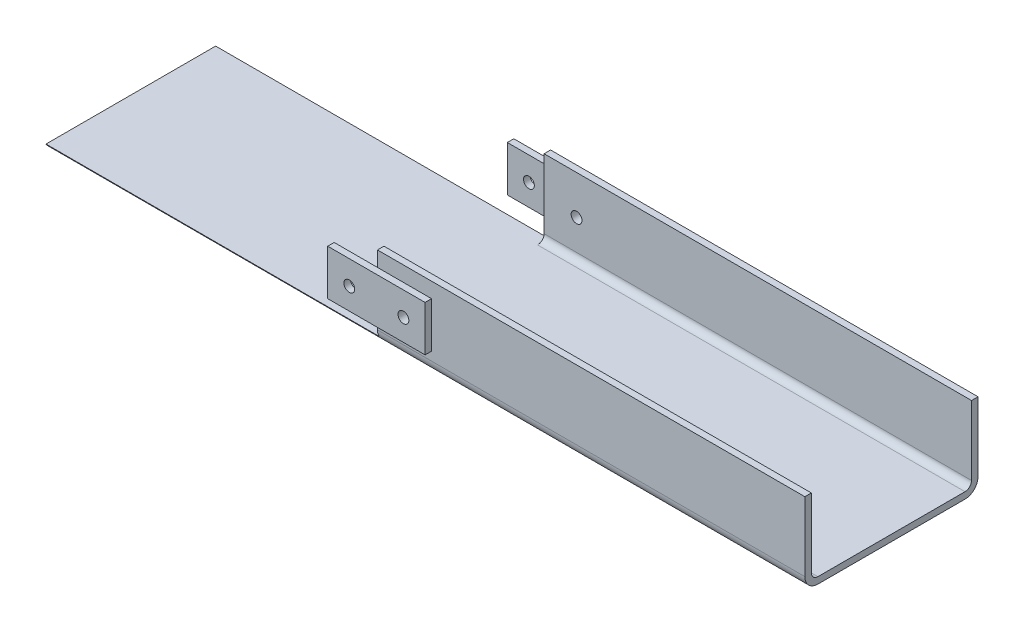
ISO-10303-21;
HEADER;
FILE_DESCRIPTION(('STEP AP214'),'2;1');
FILE_NAME('part.step','',(''),(''),'','','');
FILE_SCHEMA(('AUTOMOTIVE_DESIGN { 1 0 10303 214 1 1 1 1 }'));
ENDSEC;
DATA;
#1=APPLICATION_CONTEXT('core data for automotive mechanical design processes');
#2=APPLICATION_PROTOCOL_DEFINITION('international standard','automotive_design',2000,#1);
#3=PRODUCT_CONTEXT('',#1,'mechanical');
#4=PRODUCT('Part','Part','',(#3));
#5=PRODUCT_RELATED_PRODUCT_CATEGORY('part','',(#4));
#6=PRODUCT_DEFINITION_FORMATION('','',#4);
#7=PRODUCT_DEFINITION_CONTEXT('part definition',#1,'design');
#8=PRODUCT_DEFINITION('design','',#6,#7);
#9=PRODUCT_DEFINITION_SHAPE('','',#8);
#10=(LENGTH_UNIT() NAMED_UNIT(*) SI_UNIT(.MILLI.,.METRE.));
#11=(NAMED_UNIT(*) PLANE_ANGLE_UNIT() SI_UNIT($,.RADIAN.));
#12=(NAMED_UNIT(*) SI_UNIT($,.STERADIAN.) SOLID_ANGLE_UNIT());
#13=UNCERTAINTY_MEASURE_WITH_UNIT(LENGTH_MEASURE(1.E-05),#10,'distance_accuracy_value','');
#14=(GEOMETRIC_REPRESENTATION_CONTEXT(3) GLOBAL_UNCERTAINTY_ASSIGNED_CONTEXT((#13)) GLOBAL_UNIT_ASSIGNED_CONTEXT((#10,
#11,#12)) REPRESENTATION_CONTEXT('',''));
#15=CARTESIAN_POINT('',(0.,0.,0.));
#16=DIRECTION('',(0.,0.,1.));
#17=DIRECTION('',(1.,0.,0.));
#18=AXIS2_PLACEMENT_3D('',#15,#16,#17);
#19=CARTESIAN_POINT('',(0.,0.,40.));
#20=DIRECTION('',(0.,0.,1.));
#21=DIRECTION('',(1.,0.,0.));
#22=AXIS2_PLACEMENT_3D('',#19,#20,#21);
#23=PLANE('',#22);
#24=DIRECTION('',(0.,1.,0.));
#25=VECTOR('',#24,1.);
#26=CARTESIAN_POINT('',(75.,10.,40.));
#27=LINE('',#26,#25);
#28=CARTESIAN_POINT('',(75.,10.,40.));
#29=VERTEX_POINT('',#28);
#30=CARTESIAN_POINT('',(75.,31.,40.));
#31=VERTEX_POINT('',#30);
#32=EDGE_CURVE('E63',#29,#31,#27,.T.);
#33=ORIENTED_EDGE('',*,*,#32,.F.);
#34=DIRECTION('',(1.,0.,0.));
#35=VECTOR('',#34,1.);
#36=CARTESIAN_POINT('',(30.,10.,40.));
#37=LINE('',#36,#35);
#38=CARTESIAN_POINT('',(50.,10.,40.));
#39=VERTEX_POINT('',#38);
#40=EDGE_CURVE('E260',#39,#29,#37,.T.);
#41=ORIENTED_EDGE('',*,*,#40,.F.);
#42=DIRECTION('',(0.,-1.,0.));
#43=VECTOR('',#42,1.);
#44=CARTESIAN_POINT('',(50.,38.,40.));
#45=LINE('',#44,#43);
#46=CARTESIAN_POINT('',(50.,6.,40.));
#47=VERTEX_POINT('',#46);
#48=EDGE_CURVE('E308',#39,#47,#45,.T.);
#49=ORIENTED_EDGE('',*,*,#48,.T.);
#50=DIRECTION('',(1.,0.,0.));
#51=VECTOR('',#50,1.);
#52=CARTESIAN_POINT('',(247.5,6.,40.));
#53=LINE('',#52,#51);
#54=CARTESIAN_POINT('',(247.5,6.,40.));
#55=VERTEX_POINT('',#54);
#56=EDGE_CURVE('E360',#47,#55,#53,.T.);
#57=ORIENTED_EDGE('',*,*,#56,.T.);
#58=DIRECTION('',(0.,1.,0.));
#59=VECTOR('',#58,1.);
#60=CARTESIAN_POINT('',(247.5,0.,40.));
#61=LINE('',#60,#59);
#62=CARTESIAN_POINT('',(247.5,38.,40.));
#63=VERTEX_POINT('',#62);
#64=EDGE_CURVE('E325',#55,#63,#61,.T.);
#65=ORIENTED_EDGE('',*,*,#64,.T.);
#66=DIRECTION('',(-1.,0.,0.));
#67=VECTOR('',#66,1.);
#68=CARTESIAN_POINT('',(247.5,38.,40.));
#69=LINE('',#68,#67);
#70=CARTESIAN_POINT('',(50.,38.,40.));
#71=VERTEX_POINT('',#70);
#72=EDGE_CURVE('E306',#63,#71,#69,.T.);
#73=ORIENTED_EDGE('',*,*,#72,.T.);
#74=CARTESIAN_POINT('',(50.,31.,40.));
#75=VERTEX_POINT('',#74);
#76=EDGE_CURVE('E303',#71,#75,#45,.T.);
#77=ORIENTED_EDGE('',*,*,#76,.T.);
#78=DIRECTION('',(-1.,0.,0.));
#79=VECTOR('',#78,1.);
#80=CARTESIAN_POINT('',(75.,31.,40.));
#81=LINE('',#80,#79);
#82=EDGE_CURVE('E251',#31,#75,#81,.T.);
#83=ORIENTED_EDGE('',*,*,#82,.F.);
#84=EDGE_LOOP('',(#33,#41,#49,#57,#65,#73,#77,#83));
#85=FACE_BOUND('',#84,.T.);
#86=ADVANCED_FACE('F39',(#85),#23,.T.);
#87=CARTESIAN_POINT('',(-103.962954093293,3.,40.));
#88=DIRECTION('',(0.961884622420712,0.273455614589577,0.));
#89=DIRECTION('',(-0.273455614589577,0.961884622420712,0.));
#90=AXIS2_PLACEMENT_3D('',#87,#88,#89);
#91=PLANE('',#90);
#92=DIRECTION('',(0.,0.,-1.));
#93=VECTOR('',#92,1.);
#94=CARTESIAN_POINT('',(-103.962954093293,3.,40.));
#95=LINE('',#94,#93);
#96=CARTESIAN_POINT('',(-103.962954093293,3.,39.1961524227066));
#97=VERTEX_POINT('',#96);
#98=CARTESIAN_POINT('',(-103.962954093293,3.,-39.1961524227066));
#99=VERTEX_POINT('',#98);
#100=EDGE_CURVE('E327',#97,#99,#95,.T.);
#101=ORIENTED_EDGE('',*,*,#100,.T.);
#102=CARTESIAN_POINT('',(-104.81582856976,6.,-34.));
#103=DIRECTION('',(0.961884622420712,0.273455614589577,0.));
#104=DIRECTION('',(0.273455614589577,-0.961884622420712,0.));
#105=AXIS2_PLACEMENT_3D('',#102,#103,#104);
#106=ELLIPSE('',#105,6.23775436278437,6.);
#107=CARTESIAN_POINT('',(-103.110079616826,0.,-34.));
#108=VERTEX_POINT('',#107);
#109=EDGE_CURVE('E11',#99,#108,#106,.F.);
#110=ORIENTED_EDGE('',*,*,#109,.T.);
#111=DIRECTION('',(0.,0.,-1.));
#112=VECTOR('',#111,1.);
#113=CARTESIAN_POINT('',(-103.110079616826,0.,40.));
#114=LINE('',#113,#112);
#115=CARTESIAN_POINT('',(-103.110079616826,0.,34.));
#116=VERTEX_POINT('',#115);
#117=EDGE_CURVE('E337',#116,#108,#114,.T.);
#118=ORIENTED_EDGE('',*,*,#117,.F.);
#119=CARTESIAN_POINT('',(-104.81582856976,6.,34.));
#120=DIRECTION('',(0.961884622420712,0.273455614589577,0.));
#121=DIRECTION('',(-0.273455614589577,0.961884622420712,0.));
#122=AXIS2_PLACEMENT_3D('',#119,#120,#121);
#123=ELLIPSE('',#122,6.23775436278437,6.);
#124=EDGE_CURVE('E367',#116,#97,#123,.F.);
#125=ORIENTED_EDGE('',*,*,#124,.T.);
#126=EDGE_LOOP('',(#101,#110,#118,#125));
#127=FACE_BOUND('',#126,.T.);
#128=ADVANCED_FACE('F394',(#127),#91,.F.);
#129=CARTESIAN_POINT('',(-103.110079616826,0.,40.));
#130=DIRECTION('',(0.,1.,0.));
#131=DIRECTION('',(0.,0.,1.));
#132=AXIS2_PLACEMENT_3D('',#129,#130,#131);
#133=PLANE('',#132);
#134=ORIENTED_EDGE('',*,*,#117,.T.);
#135=DIRECTION('',(1.,0.,0.));
#136=VECTOR('',#135,1.);
#137=CARTESIAN_POINT('',(-103.110079616826,0.,-34.));
#138=LINE('',#137,#136);
#139=CARTESIAN_POINT('',(247.5,0.,-34.));
#140=VERTEX_POINT('',#139);
#141=EDGE_CURVE('E374',#108,#140,#138,.T.);
#142=ORIENTED_EDGE('',*,*,#141,.T.);
#143=DIRECTION('',(0.,0.,-1.));
#144=VECTOR('',#143,1.);
#145=CARTESIAN_POINT('',(247.5,0.,40.));
#146=LINE('',#145,#144);
#147=CARTESIAN_POINT('',(247.5,0.,34.));
#148=VERTEX_POINT('',#147);
#149=EDGE_CURVE('E334',#148,#140,#146,.T.);
#150=ORIENTED_EDGE('',*,*,#149,.F.);
#151=DIRECTION('',(1.,0.,0.));
#152=VECTOR('',#151,1.);
#153=CARTESIAN_POINT('',(-103.110079616826,0.,34.));
#154=LINE('',#153,#152);
#155=EDGE_CURVE('E365',#148,#116,#154,.F.);
#156=ORIENTED_EDGE('',*,*,#155,.T.);
#157=EDGE_LOOP('',(#134,#142,#150,#156));
#158=FACE_BOUND('',#157,.T.);
#159=ADVANCED_FACE('F401',(#158),#133,.F.);
#160=CARTESIAN_POINT('',(247.5,0.,40.));
#161=DIRECTION('',(-1.,0.,0.));
#162=DIRECTION('',(0.,0.,1.));
#163=AXIS2_PLACEMENT_3D('',#160,#161,#162);
#164=PLANE('',#163);
#165=ORIENTED_EDGE('',*,*,#149,.T.);
#166=CARTESIAN_POINT('',(247.5,6.,-34.));
#167=DIRECTION('',(-1.,0.,0.));
#168=DIRECTION('',(0.,0.,1.));
#169=AXIS2_PLACEMENT_3D('',#166,#167,#168);
#170=CIRCLE('',#169,6.);
#171=CARTESIAN_POINT('',(247.5,6.,-40.));
#172=VERTEX_POINT('',#171);
#173=EDGE_CURVE('E377',#140,#172,#170,.F.);
#174=ORIENTED_EDGE('',*,*,#173,.T.);
#175=DIRECTION('',(0.,1.,0.));
#176=VECTOR('',#175,1.);
#177=CARTESIAN_POINT('',(247.5,0.,-40.));
#178=LINE('',#177,#176);
#179=CARTESIAN_POINT('',(247.5,38.,-40.));
#180=VERTEX_POINT('',#179);
#181=EDGE_CURVE('E324',#172,#180,#178,.T.);
#182=ORIENTED_EDGE('',*,*,#181,.T.);
#183=DIRECTION('',(0.,0.,1.));
#184=VECTOR('',#183,1.);
#185=CARTESIAN_POINT('',(247.5,38.,-40.));
#186=LINE('',#185,#184);
#187=CARTESIAN_POINT('',(247.5,38.,-37.));
#188=VERTEX_POINT('',#187);
#189=EDGE_CURVE('E299',#180,#188,#186,.T.);
#190=ORIENTED_EDGE('',*,*,#189,.T.);
#191=DIRECTION('',(0.,1.,0.));
#192=VECTOR('',#191,1.);
#193=CARTESIAN_POINT('',(247.5,3.,-37.));
#194=LINE('',#193,#192);
#195=CARTESIAN_POINT('',(247.5,6.,-37.));
#196=VERTEX_POINT('',#195);
#197=EDGE_CURVE('E291',#196,#188,#194,.T.);
#198=ORIENTED_EDGE('',*,*,#197,.F.);
#199=CARTESIAN_POINT('',(247.5,6.,-34.));
#200=DIRECTION('',(-1.,0.,0.));
#201=DIRECTION('',(0.,0.,1.));
#202=AXIS2_PLACEMENT_3D('',#199,#200,#201);
#203=CIRCLE('',#202,3.);
#204=CARTESIAN_POINT('',(247.5,3.,-34.));
#205=VERTEX_POINT('',#204);
#206=EDGE_CURVE('E356',#196,#205,#203,.T.);
#207=ORIENTED_EDGE('',*,*,#206,.T.);
#208=DIRECTION('',(0.,0.,-1.));
#209=VECTOR('',#208,1.);
#210=CARTESIAN_POINT('',(247.5,3.,40.));
#211=LINE('',#210,#209);
#212=CARTESIAN_POINT('',(247.5,3.,34.));
#213=VERTEX_POINT('',#212);
#214=EDGE_CURVE('E331',#213,#205,#211,.T.);
#215=ORIENTED_EDGE('',*,*,#214,.F.);
#216=CARTESIAN_POINT('',(247.5,6.,34.));
#217=DIRECTION('',(-1.,0.,0.));
#218=DIRECTION('',(0.,0.,1.));
#219=AXIS2_PLACEMENT_3D('',#216,#217,#218);
#220=CIRCLE('',#219,3.);
#221=CARTESIAN_POINT('',(247.5,6.,37.));
#222=VERTEX_POINT('',#221);
#223=EDGE_CURVE('E345',#213,#222,#220,.T.);
#224=ORIENTED_EDGE('',*,*,#223,.T.);
#225=DIRECTION('',(0.,1.,0.));
#226=VECTOR('',#225,1.);
#227=CARTESIAN_POINT('',(247.5,3.,37.));
#228=LINE('',#227,#226);
#229=CARTESIAN_POINT('',(247.5,38.,37.));
#230=VERTEX_POINT('',#229);
#231=EDGE_CURVE('E313',#222,#230,#228,.T.);
#232=ORIENTED_EDGE('',*,*,#231,.T.);
#233=DIRECTION('',(0.,0.,-1.));
#234=VECTOR('',#233,1.);
#235=CARTESIAN_POINT('',(247.5,38.,40.));
#236=LINE('',#235,#234);
#237=EDGE_CURVE('E319',#63,#230,#236,.T.);
#238=ORIENTED_EDGE('',*,*,#237,.F.);
#239=ORIENTED_EDGE('',*,*,#64,.F.);
#240=CARTESIAN_POINT('',(247.5,6.,34.));
#241=DIRECTION('',(-1.,0.,0.));
#242=DIRECTION('',(0.,0.,1.));
#243=AXIS2_PLACEMENT_3D('',#240,#241,#242);
#244=CIRCLE('',#243,6.);
#245=EDGE_CURVE('E363',#55,#148,#244,.F.);
#246=ORIENTED_EDGE('',*,*,#245,.T.);
#247=EDGE_LOOP('',(#165,#174,#182,#190,#198,#207,#215,#224,#232,#238,#239,#246));
#248=FACE_BOUND('',#247,.T.);
#249=ADVANCED_FACE('F404',(#248),#164,.F.);
#250=CARTESIAN_POINT('',(247.5,3.,40.));
#251=DIRECTION('',(0.,-1.,0.));
#252=DIRECTION('',(0.,0.,-1.));
#253=AXIS2_PLACEMENT_3D('',#250,#251,#252);
#254=PLANE('',#253);
#255=DIRECTION('',(0.,0.,1.));
#256=VECTOR('',#255,1.);
#257=CARTESIAN_POINT('',(50.,3.,-40.));
#258=LINE('',#257,#256);
#259=CARTESIAN_POINT('',(50.,3.,-39.1961524227066));
#260=VERTEX_POINT('',#259);
#261=CARTESIAN_POINT('',(50.,3.,-34.));
#262=VERTEX_POINT('',#261);
#263=EDGE_CURVE('E288',#260,#262,#258,.T.);
#264=ORIENTED_EDGE('',*,*,#263,.F.);
#265=DIRECTION('',(1.,0.,0.));
#266=VECTOR('',#265,1.);
#267=CARTESIAN_POINT('',(50.,3.,-39.1961524227066));
#268=LINE('',#267,#266);
#269=EDGE_CURVE('E48',#260,#99,#268,.F.);
#270=ORIENTED_EDGE('',*,*,#269,.T.);
#271=ORIENTED_EDGE('',*,*,#100,.F.);
#272=DIRECTION('',(-1.,0.,0.));
#273=VECTOR('',#272,1.);
#274=CARTESIAN_POINT('',(-103.962954093293,3.,39.1961524227066));
#275=LINE('',#274,#273);
#276=CARTESIAN_POINT('',(50.,3.,39.1961524227066));
#277=VERTEX_POINT('',#276);
#278=EDGE_CURVE('E369',#97,#277,#275,.F.);
#279=ORIENTED_EDGE('',*,*,#278,.T.);
#280=DIRECTION('',(0.,0.,-1.));
#281=VECTOR('',#280,1.);
#282=CARTESIAN_POINT('',(50.,3.,40.));
#283=LINE('',#282,#281);
#284=CARTESIAN_POINT('',(50.,3.,34.));
#285=VERTEX_POINT('',#284);
#286=EDGE_CURVE('E322',#277,#285,#283,.T.);
#287=ORIENTED_EDGE('',*,*,#286,.T.);
#288=DIRECTION('',(1.,0.,0.));
#289=VECTOR('',#288,1.);
#290=CARTESIAN_POINT('',(247.5,3.,34.));
#291=LINE('',#290,#289);
#292=EDGE_CURVE('E340',#285,#213,#291,.T.);
#293=ORIENTED_EDGE('',*,*,#292,.T.);
#294=ORIENTED_EDGE('',*,*,#214,.T.);
#295=DIRECTION('',(1.,0.,0.));
#296=VECTOR('',#295,1.);
#297=CARTESIAN_POINT('',(247.5,3.,-34.));
#298=LINE('',#297,#296);
#299=EDGE_CURVE('E353',#205,#262,#298,.F.);
#300=ORIENTED_EDGE('',*,*,#299,.T.);
#301=EDGE_LOOP('',(#264,#270,#271,#279,#287,#293,#294,#300));
#302=FACE_BOUND('',#301,.T.);
#303=ADVANCED_FACE('F388',(#302),#254,.F.);
#304=CARTESIAN_POINT('',(0.,0.,-40.));
#305=DIRECTION('',(0.,0.,1.));
#306=DIRECTION('',(1.,0.,0.));
#307=AXIS2_PLACEMENT_3D('',#304,#305,#306);
#308=PLANE('',#307);
#309=DIRECTION('',(0.,1.,0.));
#310=VECTOR('',#309,1.);
#311=CARTESIAN_POINT('',(75.,10.,-40.));
#312=LINE('',#311,#310);
#313=CARTESIAN_POINT('',(75.,10.,-40.));
#314=VERTEX_POINT('',#313);
#315=CARTESIAN_POINT('',(75.,31.,-40.));
#316=VERTEX_POINT('',#315);
#317=EDGE_CURVE('E239',#314,#316,#312,.T.);
#318=ORIENTED_EDGE('',*,*,#317,.T.);
#319=DIRECTION('',(-1.,0.,0.));
#320=VECTOR('',#319,1.);
#321=CARTESIAN_POINT('',(75.,31.,-40.));
#322=LINE('',#321,#320);
#323=CARTESIAN_POINT('',(50.,31.,-40.));
#324=VERTEX_POINT('',#323);
#325=EDGE_CURVE('E224',#316,#324,#322,.T.);
#326=ORIENTED_EDGE('',*,*,#325,.T.);
#327=DIRECTION('',(0.,-1.,0.));
#328=VECTOR('',#327,1.);
#329=CARTESIAN_POINT('',(50.,38.,-40.));
#330=LINE('',#329,#328);
#331=CARTESIAN_POINT('',(50.,38.,-40.));
#332=VERTEX_POINT('',#331);
#333=EDGE_CURVE('E280',#332,#324,#330,.T.);
#334=ORIENTED_EDGE('',*,*,#333,.F.);
#335=DIRECTION('',(-1.,0.,0.));
#336=VECTOR('',#335,1.);
#337=CARTESIAN_POINT('',(247.5,38.,-40.));
#338=LINE('',#337,#336);
#339=EDGE_CURVE('E283',#180,#332,#338,.T.);
#340=ORIENTED_EDGE('',*,*,#339,.F.);
#341=ORIENTED_EDGE('',*,*,#181,.F.);
#342=DIRECTION('',(1.,0.,0.));
#343=VECTOR('',#342,1.);
#344=CARTESIAN_POINT('',(0.,6.,-40.));
#345=LINE('',#344,#343);
#346=CARTESIAN_POINT('',(50.,6.,-40.));
#347=VERTEX_POINT('',#346);
#348=EDGE_CURVE('E379',#172,#347,#345,.F.);
#349=ORIENTED_EDGE('',*,*,#348,.T.);
#350=CARTESIAN_POINT('',(50.,10.,-40.));
#351=VERTEX_POINT('',#350);
#352=EDGE_CURVE('E285',#351,#347,#330,.T.);
#353=ORIENTED_EDGE('',*,*,#352,.F.);
#354=DIRECTION('',(1.,0.,0.));
#355=VECTOR('',#354,1.);
#356=CARTESIAN_POINT('',(30.,10.,-40.));
#357=LINE('',#356,#355);
#358=EDGE_CURVE('E237',#351,#314,#357,.T.);
#359=ORIENTED_EDGE('',*,*,#358,.T.);
#360=EDGE_LOOP('',(#318,#326,#334,#340,#341,#349,#353,#359));
#361=FACE_BOUND('',#360,.T.);
#362=ADVANCED_FACE('F479',(#361),#308,.F.);
#363=CARTESIAN_POINT('',(50.,38.,40.));
#364=DIRECTION('',(1.,0.,0.));
#365=DIRECTION('',(0.,0.,-1.));
#366=AXIS2_PLACEMENT_3D('',#363,#364,#365);
#367=PLANE('',#366);
#368=ORIENTED_EDGE('',*,*,#286,.F.);
#369=CARTESIAN_POINT('',(50.,6.,34.));
#370=DIRECTION('',(1.,0.,0.));
#371=DIRECTION('',(0.,0.,-1.));
#372=AXIS2_PLACEMENT_3D('',#369,#370,#371);
#373=CIRCLE('',#372,6.);
#374=EDGE_CURVE('E371',#277,#47,#373,.F.);
#375=ORIENTED_EDGE('',*,*,#374,.T.);
#376=ORIENTED_EDGE('',*,*,#48,.F.);
#377=EDGE_CURVE('E307',#75,#39,#45,.T.);
#378=ORIENTED_EDGE('',*,*,#377,.F.);
#379=ORIENTED_EDGE('',*,*,#76,.F.);
#380=DIRECTION('',(0.,0.,-1.));
#381=VECTOR('',#380,1.);
#382=CARTESIAN_POINT('',(50.,38.,40.));
#383=LINE('',#382,#381);
#384=CARTESIAN_POINT('',(50.,38.,37.));
#385=VERTEX_POINT('',#384);
#386=EDGE_CURVE('E310',#71,#385,#383,.T.);
#387=ORIENTED_EDGE('',*,*,#386,.T.);
#388=DIRECTION('',(0.,-1.,0.));
#389=VECTOR('',#388,1.);
#390=CARTESIAN_POINT('',(50.,38.,37.));
#391=LINE('',#390,#389);
#392=CARTESIAN_POINT('',(50.,6.,37.));
#393=VERTEX_POINT('',#392);
#394=EDGE_CURVE('E298',#385,#393,#391,.T.);
#395=ORIENTED_EDGE('',*,*,#394,.T.);
#396=CARTESIAN_POINT('',(50.,6.,34.));
#397=DIRECTION('',(1.,0.,0.));
#398=DIRECTION('',(0.,0.,-1.));
#399=AXIS2_PLACEMENT_3D('',#396,#397,#398);
#400=CIRCLE('',#399,3.);
#401=EDGE_CURVE('E347',#393,#285,#400,.T.);
#402=ORIENTED_EDGE('',*,*,#401,.T.);
#403=EDGE_LOOP('',(#368,#375,#376,#378,#379,#387,#395,#402));
#404=FACE_BOUND('',#403,.T.);
#405=ADVANCED_FACE('F415',(#404),#367,.F.);
#406=CARTESIAN_POINT('',(247.5,38.,40.));
#407=DIRECTION('',(0.,-1.,0.));
#408=DIRECTION('',(0.,0.,-1.));
#409=AXIS2_PLACEMENT_3D('',#406,#407,#408);
#410=PLANE('',#409);
#411=DIRECTION('',(-1.,0.,0.));
#412=VECTOR('',#411,1.);
#413=CARTESIAN_POINT('',(247.5,38.,37.));
#414=LINE('',#413,#412);
#415=EDGE_CURVE('E315',#230,#385,#414,.T.);
#416=ORIENTED_EDGE('',*,*,#415,.T.);
#417=ORIENTED_EDGE('',*,*,#386,.F.);
#418=ORIENTED_EDGE('',*,*,#72,.F.);
#419=ORIENTED_EDGE('',*,*,#237,.T.);
#420=EDGE_LOOP('',(#416,#417,#418,#419));
#421=FACE_BOUND('',#420,.T.);
#422=ADVANCED_FACE('F429',(#421),#410,.F.);
#423=CARTESIAN_POINT('',(0.,0.,37.));
#424=DIRECTION('',(0.,0.,1.));
#425=DIRECTION('',(1.,0.,0.));
#426=AXIS2_PLACEMENT_3D('',#423,#424,#425);
#427=PLANE('',#426);
#428=CARTESIAN_POINT('',(65.,20.,37.));
#429=DIRECTION('',(0.,0.,1.));
#430=DIRECTION('',(1.,0.,0.));
#431=AXIS2_PLACEMENT_3D('',#428,#429,#430);
#432=CIRCLE('',#431,2.5);
#433=CARTESIAN_POINT('',(67.5,20.,37.));
#434=VERTEX_POINT('',#433);
#435=EDGE_CURVE('E230',#434,#434,#432,.T.);
#436=ORIENTED_EDGE('',*,*,#435,.T.);
#437=EDGE_LOOP('',(#436));
#438=FACE_BOUND('',#437,.T.);
#439=ORIENTED_EDGE('',*,*,#231,.F.);
#440=DIRECTION('',(1.,0.,0.));
#441=VECTOR('',#440,1.);
#442=CARTESIAN_POINT('',(50.,6.,37.));
#443=LINE('',#442,#441);
#444=EDGE_CURVE('E343',#222,#393,#443,.F.);
#445=ORIENTED_EDGE('',*,*,#444,.T.);
#446=ORIENTED_EDGE('',*,*,#394,.F.);
#447=ORIENTED_EDGE('',*,*,#415,.F.);
#448=EDGE_LOOP('',(#439,#445,#446,#447));
#449=FACE_BOUND('',#448,.T.);
#450=ADVANCED_FACE('F426',(#438,#449),#427,.F.);
#451=CARTESIAN_POINT('',(50.,38.,-40.));
#452=DIRECTION('',(-1.,0.,0.));
#453=DIRECTION('',(0.,0.,1.));
#454=AXIS2_PLACEMENT_3D('',#451,#452,#453);
#455=PLANE('',#454);
#456=ORIENTED_EDGE('',*,*,#333,.T.);
#457=EDGE_CURVE('E284',#324,#351,#330,.T.);
#458=ORIENTED_EDGE('',*,*,#457,.T.);
#459=ORIENTED_EDGE('',*,*,#352,.T.);
#460=CARTESIAN_POINT('',(50.,6.,-34.));
#461=DIRECTION('',(-1.,0.,0.));
#462=DIRECTION('',(0.,0.,1.));
#463=AXIS2_PLACEMENT_3D('',#460,#461,#462);
#464=CIRCLE('',#463,6.);
#465=EDGE_CURVE('E382',#347,#260,#464,.T.);
#466=ORIENTED_EDGE('',*,*,#465,.T.);
#467=ORIENTED_EDGE('',*,*,#263,.T.);
#468=CARTESIAN_POINT('',(50.,6.,-34.));
#469=DIRECTION('',(-1.,0.,0.));
#470=DIRECTION('',(0.,0.,1.));
#471=AXIS2_PLACEMENT_3D('',#468,#469,#470);
#472=CIRCLE('',#471,3.);
#473=CARTESIAN_POINT('',(50.,6.,-37.));
#474=VERTEX_POINT('',#473);
#475=EDGE_CURVE('E358',#262,#474,#472,.F.);
#476=ORIENTED_EDGE('',*,*,#475,.T.);
#477=DIRECTION('',(0.,-1.,0.));
#478=VECTOR('',#477,1.);
#479=CARTESIAN_POINT('',(50.,38.,-37.));
#480=LINE('',#479,#478);
#481=CARTESIAN_POINT('',(50.,38.,-37.));
#482=VERTEX_POINT('',#481);
#483=EDGE_CURVE('E279',#482,#474,#480,.T.);
#484=ORIENTED_EDGE('',*,*,#483,.F.);
#485=DIRECTION('',(0.,0.,1.));
#486=VECTOR('',#485,1.);
#487=CARTESIAN_POINT('',(50.,38.,-40.));
#488=LINE('',#487,#486);
#489=EDGE_CURVE('E296',#332,#482,#488,.T.);
#490=ORIENTED_EDGE('',*,*,#489,.F.);
#491=EDGE_LOOP('',(#456,#458,#459,#466,#467,#476,#484,#490));
#492=FACE_BOUND('',#491,.T.);
#493=ADVANCED_FACE('F517',(#492),#455,.T.);
#494=CARTESIAN_POINT('',(247.5,38.,-40.));
#495=DIRECTION('',(0.,1.,0.));
#496=DIRECTION('',(0.,0.,1.));
#497=AXIS2_PLACEMENT_3D('',#494,#495,#496);
#498=PLANE('',#497);
#499=DIRECTION('',(-1.,0.,0.));
#500=VECTOR('',#499,1.);
#501=CARTESIAN_POINT('',(247.5,38.,-37.));
#502=LINE('',#501,#500);
#503=EDGE_CURVE('E293',#188,#482,#502,.T.);
#504=ORIENTED_EDGE('',*,*,#503,.F.);
#505=ORIENTED_EDGE('',*,*,#189,.F.);
#506=ORIENTED_EDGE('',*,*,#339,.T.);
#507=ORIENTED_EDGE('',*,*,#489,.T.);
#508=EDGE_LOOP('',(#504,#505,#506,#507));
#509=FACE_BOUND('',#508,.T.);
#510=ADVANCED_FACE('F513',(#509),#498,.T.);
#511=CARTESIAN_POINT('',(0.,0.,-37.));
#512=DIRECTION('',(0.,0.,1.));
#513=DIRECTION('',(1.,0.,0.));
#514=AXIS2_PLACEMENT_3D('',#511,#512,#513);
#515=PLANE('',#514);
#516=CARTESIAN_POINT('',(65.,20.,-37.));
#517=DIRECTION('',(0.,0.,1.));
#518=DIRECTION('',(1.,0.,0.));
#519=AXIS2_PLACEMENT_3D('',#516,#517,#518);
#520=CIRCLE('',#519,2.5);
#521=CARTESIAN_POINT('',(67.5,20.,-37.));
#522=VERTEX_POINT('',#521);
#523=EDGE_CURVE('E712',#522,#522,#520,.T.);
#524=ORIENTED_EDGE('',*,*,#523,.F.);
#525=EDGE_LOOP('',(#524));
#526=FACE_BOUND('',#525,.T.);
#527=ORIENTED_EDGE('',*,*,#483,.T.);
#528=DIRECTION('',(1.,0.,0.));
#529=VECTOR('',#528,1.);
#530=CARTESIAN_POINT('',(0.,6.,-37.));
#531=LINE('',#530,#529);
#532=EDGE_CURVE('E350',#474,#196,#531,.T.);
#533=ORIENTED_EDGE('',*,*,#532,.T.);
#534=ORIENTED_EDGE('',*,*,#197,.T.);
#535=ORIENTED_EDGE('',*,*,#503,.T.);
#536=EDGE_LOOP('',(#527,#533,#534,#535));
#537=FACE_BOUND('',#536,.T.);
#538=ADVANCED_FACE('F492',(#526,#537),#515,.T.);
#539=CARTESIAN_POINT('',(247.5,6.,34.));
#540=DIRECTION('',(-1.,0.,0.));
#541=DIRECTION('',(0.,0.,1.));
#542=AXIS2_PLACEMENT_3D('',#539,#540,#541);
#543=CYLINDRICAL_SURFACE('',#542,3.);
#544=ORIENTED_EDGE('',*,*,#401,.F.);
#545=ORIENTED_EDGE('',*,*,#444,.F.);
#546=ORIENTED_EDGE('',*,*,#223,.F.);
#547=ORIENTED_EDGE('',*,*,#292,.F.);
#548=EDGE_LOOP('',(#544,#545,#546,#547));
#549=FACE_BOUND('',#548,.T.);
#550=ADVANCED_FACE('F422',(#549),#543,.F.);
#551=CARTESIAN_POINT('',(0.,6.,-34.));
#552=DIRECTION('',(1.,0.,0.));
#553=DIRECTION('',(0.,0.,-1.));
#554=AXIS2_PLACEMENT_3D('',#551,#552,#553);
#555=CYLINDRICAL_SURFACE('',#554,3.);
#556=ORIENTED_EDGE('',*,*,#475,.F.);
#557=ORIENTED_EDGE('',*,*,#299,.F.);
#558=ORIENTED_EDGE('',*,*,#206,.F.);
#559=ORIENTED_EDGE('',*,*,#532,.F.);
#560=EDGE_LOOP('',(#556,#557,#558,#559));
#561=FACE_BOUND('',#560,.T.);
#562=ADVANCED_FACE('F491',(#561),#555,.F.);
#563=CARTESIAN_POINT('',(0.,6.,34.));
#564=DIRECTION('',(-1.,0.,0.));
#565=DIRECTION('',(0.,0.,1.));
#566=AXIS2_PLACEMENT_3D('',#563,#564,#565);
#567=CYLINDRICAL_SURFACE('',#566,6.);
#568=ORIENTED_EDGE('',*,*,#124,.F.);
#569=ORIENTED_EDGE('',*,*,#155,.F.);
#570=ORIENTED_EDGE('',*,*,#245,.F.);
#571=ORIENTED_EDGE('',*,*,#56,.F.);
#572=ORIENTED_EDGE('',*,*,#374,.F.);
#573=ORIENTED_EDGE('',*,*,#278,.F.);
#574=EDGE_LOOP('',(#568,#569,#570,#571,#572,#573));
#575=FACE_BOUND('',#574,.T.);
#576=ADVANCED_FACE('F410',(#575),#567,.T.);
#577=CARTESIAN_POINT('',(-103.110079616826,6.,-34.));
#578=DIRECTION('',(1.,0.,0.));
#579=DIRECTION('',(0.,0.,-1.));
#580=AXIS2_PLACEMENT_3D('',#577,#578,#579);
#581=CYLINDRICAL_SURFACE('',#580,6.);
#582=ORIENTED_EDGE('',*,*,#465,.F.);
#583=ORIENTED_EDGE('',*,*,#348,.F.);
#584=ORIENTED_EDGE('',*,*,#173,.F.);
#585=ORIENTED_EDGE('',*,*,#141,.F.);
#586=ORIENTED_EDGE('',*,*,#109,.F.);
#587=ORIENTED_EDGE('',*,*,#269,.F.);
#588=EDGE_LOOP('',(#582,#583,#584,#585,#586,#587));
#589=FACE_BOUND('',#588,.T.);
#590=ADVANCED_FACE('F41',(#589),#581,.T.);
#591=CARTESIAN_POINT('',(0.,0.,40.));
#592=DIRECTION('',(0.,0.,1.));
#593=DIRECTION('',(1.,0.,0.));
#594=AXIS2_PLACEMENT_3D('',#591,#592,#593);
#595=PLANE('',#594);
#596=CARTESIAN_POINT('',(40.,20.,40.));
#597=DIRECTION('',(0.,0.,1.));
#598=DIRECTION('',(1.,0.,0.));
#599=AXIS2_PLACEMENT_3D('',#596,#597,#598);
#600=CIRCLE('',#599,2.5);
#601=CARTESIAN_POINT('',(42.5,20.,40.));
#602=VERTEX_POINT('',#601);
#603=EDGE_CURVE('E711',#602,#602,#600,.T.);
#604=ORIENTED_EDGE('',*,*,#603,.T.);
#605=EDGE_LOOP('',(#604));
#606=FACE_BOUND('',#605,.T.);
#607=CARTESIAN_POINT('',(30.,31.,40.));
#608=VERTEX_POINT('',#607);
#609=EDGE_CURVE('E265',#75,#608,#81,.T.);
#610=ORIENTED_EDGE('',*,*,#609,.F.);
#611=ORIENTED_EDGE('',*,*,#377,.T.);
#612=CARTESIAN_POINT('',(30.,10.,40.));
#613=VERTEX_POINT('',#612);
#614=EDGE_CURVE('E261',#613,#39,#37,.T.);
#615=ORIENTED_EDGE('',*,*,#614,.F.);
#616=DIRECTION('',(0.,-1.,0.));
#617=VECTOR('',#616,1.);
#618=CARTESIAN_POINT('',(30.,31.,40.));
#619=LINE('',#618,#617);
#620=EDGE_CURVE('E243',#608,#613,#619,.T.);
#621=ORIENTED_EDGE('',*,*,#620,.F.);
#622=EDGE_LOOP('',(#610,#611,#615,#621));
#623=FACE_BOUND('',#622,.T.);
#624=ADVANCED_FACE('F435',(#606,#623),#595,.F.);
#625=CARTESIAN_POINT('',(30.,31.,43.));
#626=DIRECTION('',(1.,0.,0.));
#627=DIRECTION('',(0.,0.,-1.));
#628=AXIS2_PLACEMENT_3D('',#625,#626,#627);
#629=PLANE('',#628);
#630=ORIENTED_EDGE('',*,*,#620,.T.);
#631=DIRECTION('',(0.,0.,-1.));
#632=VECTOR('',#631,1.);
#633=CARTESIAN_POINT('',(30.,10.,43.));
#634=LINE('',#633,#632);
#635=CARTESIAN_POINT('',(30.,10.,43.));
#636=VERTEX_POINT('',#635);
#637=EDGE_CURVE('E276',#636,#613,#634,.T.);
#638=ORIENTED_EDGE('',*,*,#637,.F.);
#639=DIRECTION('',(0.,-1.,0.));
#640=VECTOR('',#639,1.);
#641=CARTESIAN_POINT('',(30.,31.,43.));
#642=LINE('',#641,#640);
#643=CARTESIAN_POINT('',(30.,31.,43.));
#644=VERTEX_POINT('',#643);
#645=EDGE_CURVE('E247',#644,#636,#642,.T.);
#646=ORIENTED_EDGE('',*,*,#645,.F.);
#647=DIRECTION('',(0.,0.,-1.));
#648=VECTOR('',#647,1.);
#649=CARTESIAN_POINT('',(30.,31.,43.));
#650=LINE('',#649,#648);
#651=EDGE_CURVE('E257',#644,#608,#650,.T.);
#652=ORIENTED_EDGE('',*,*,#651,.T.);
#653=EDGE_LOOP('',(#630,#638,#646,#652));
#654=FACE_BOUND('',#653,.T.);
#655=ADVANCED_FACE('F450',(#654),#629,.F.);
#656=CARTESIAN_POINT('',(30.,10.,43.));
#657=DIRECTION('',(0.,1.,0.));
#658=DIRECTION('',(0.,0.,1.));
#659=AXIS2_PLACEMENT_3D('',#656,#657,#658);
#660=PLANE('',#659);
#661=ORIENTED_EDGE('',*,*,#614,.T.);
#662=ORIENTED_EDGE('',*,*,#40,.T.);
#663=DIRECTION('',(0.,0.,-1.));
#664=VECTOR('',#663,1.);
#665=CARTESIAN_POINT('',(75.,10.,43.));
#666=LINE('',#665,#664);
#667=CARTESIAN_POINT('',(75.,10.,43.));
#668=VERTEX_POINT('',#667);
#669=EDGE_CURVE('E273',#668,#29,#666,.T.);
#670=ORIENTED_EDGE('',*,*,#669,.F.);
#671=DIRECTION('',(1.,0.,0.));
#672=VECTOR('',#671,1.);
#673=CARTESIAN_POINT('',(30.,10.,43.));
#674=LINE('',#673,#672);
#675=EDGE_CURVE('E250',#636,#668,#674,.T.);
#676=ORIENTED_EDGE('',*,*,#675,.F.);
#677=ORIENTED_EDGE('',*,*,#637,.T.);
#678=EDGE_LOOP('',(#661,#662,#670,#676,#677));
#679=FACE_BOUND('',#678,.T.);
#680=ADVANCED_FACE('F446',(#679),#660,.F.);
#681=CARTESIAN_POINT('',(75.,10.,43.));
#682=DIRECTION('',(-1.,0.,0.));
#683=DIRECTION('',(0.,0.,1.));
#684=AXIS2_PLACEMENT_3D('',#681,#682,#683);
#685=PLANE('',#684);
#686=ORIENTED_EDGE('',*,*,#32,.T.);
#687=DIRECTION('',(0.,0.,-1.));
#688=VECTOR('',#687,1.);
#689=CARTESIAN_POINT('',(75.,31.,43.));
#690=LINE('',#689,#688);
#691=CARTESIAN_POINT('',(75.,31.,43.));
#692=VERTEX_POINT('',#691);
#693=EDGE_CURVE('E270',#692,#31,#690,.T.);
#694=ORIENTED_EDGE('',*,*,#693,.F.);
#695=DIRECTION('',(0.,1.,0.));
#696=VECTOR('',#695,1.);
#697=CARTESIAN_POINT('',(75.,10.,43.));
#698=LINE('',#697,#696);
#699=EDGE_CURVE('E253',#668,#692,#698,.T.);
#700=ORIENTED_EDGE('',*,*,#699,.F.);
#701=ORIENTED_EDGE('',*,*,#669,.T.);
#702=EDGE_LOOP('',(#686,#694,#700,#701));
#703=FACE_BOUND('',#702,.T.);
#704=ADVANCED_FACE('F443',(#703),#685,.F.);
#705=CARTESIAN_POINT('',(75.,31.,43.));
#706=DIRECTION('',(0.,-1.,0.));
#707=DIRECTION('',(0.,0.,-1.));
#708=AXIS2_PLACEMENT_3D('',#705,#706,#707);
#709=PLANE('',#708);
#710=ORIENTED_EDGE('',*,*,#82,.T.);
#711=ORIENTED_EDGE('',*,*,#609,.T.);
#712=ORIENTED_EDGE('',*,*,#651,.F.);
#713=DIRECTION('',(-1.,0.,0.));
#714=VECTOR('',#713,1.);
#715=CARTESIAN_POINT('',(75.,31.,43.));
#716=LINE('',#715,#714);
#717=EDGE_CURVE('E255',#692,#644,#716,.T.);
#718=ORIENTED_EDGE('',*,*,#717,.F.);
#719=ORIENTED_EDGE('',*,*,#693,.T.);
#720=EDGE_LOOP('',(#710,#711,#712,#718,#719));
#721=FACE_BOUND('',#720,.T.);
#722=ADVANCED_FACE('F438',(#721),#709,.F.);
#723=CARTESIAN_POINT('',(0.,0.,43.));
#724=DIRECTION('',(0.,0.,1.));
#725=DIRECTION('',(1.,0.,0.));
#726=AXIS2_PLACEMENT_3D('',#723,#724,#725);
#727=PLANE('',#726);
#728=CARTESIAN_POINT('',(40.,20.,43.));
#729=DIRECTION('',(0.,0.,1.));
#730=DIRECTION('',(1.,0.,0.));
#731=AXIS2_PLACEMENT_3D('',#728,#729,#730);
#732=CIRCLE('',#731,2.5);
#733=CARTESIAN_POINT('',(42.5,20.,43.));
#734=VERTEX_POINT('',#733);
#735=EDGE_CURVE('E709',#734,#734,#732,.T.);
#736=ORIENTED_EDGE('',*,*,#735,.F.);
#737=EDGE_LOOP('',(#736));
#738=FACE_BOUND('',#737,.T.);
#739=CARTESIAN_POINT('',(65.,20.,43.));
#740=DIRECTION('',(0.,0.,1.));
#741=DIRECTION('',(1.,0.,0.));
#742=AXIS2_PLACEMENT_3D('',#739,#740,#741);
#743=CIRCLE('',#742,2.5);
#744=CARTESIAN_POINT('',(67.5,20.,43.));
#745=VERTEX_POINT('',#744);
#746=EDGE_CURVE('E721',#745,#745,#743,.T.);
#747=ORIENTED_EDGE('',*,*,#746,.F.);
#748=EDGE_LOOP('',(#747));
#749=FACE_BOUND('',#748,.T.);
#750=ORIENTED_EDGE('',*,*,#645,.T.);
#751=ORIENTED_EDGE('',*,*,#675,.T.);
#752=ORIENTED_EDGE('',*,*,#699,.T.);
#753=ORIENTED_EDGE('',*,*,#717,.T.);
#754=EDGE_LOOP('',(#750,#751,#752,#753));
#755=FACE_BOUND('',#754,.T.);
#756=ADVANCED_FACE('F452',(#738,#749,#755),#727,.T.);
#757=CARTESIAN_POINT('',(30.,31.,-43.));
#758=DIRECTION('',(-1.,0.,0.));
#759=DIRECTION('',(0.,0.,1.));
#760=AXIS2_PLACEMENT_3D('',#757,#758,#759);
#761=PLANE('',#760);
#762=DIRECTION('',(0.,-1.,0.));
#763=VECTOR('',#762,1.);
#764=CARTESIAN_POINT('',(30.,31.,-40.));
#765=LINE('',#764,#763);
#766=CARTESIAN_POINT('',(30.,31.,-40.));
#767=VERTEX_POINT('',#766);
#768=CARTESIAN_POINT('',(30.,10.,-40.));
#769=VERTEX_POINT('',#768);
#770=EDGE_CURVE('E235',#767,#769,#765,.T.);
#771=ORIENTED_EDGE('',*,*,#770,.F.);
#772=DIRECTION('',(0.,0.,1.));
#773=VECTOR('',#772,1.);
#774=CARTESIAN_POINT('',(30.,31.,-43.));
#775=LINE('',#774,#773);
#776=CARTESIAN_POINT('',(30.,31.,-43.));
#777=VERTEX_POINT('',#776);
#778=EDGE_CURVE('E223',#777,#767,#775,.T.);
#779=ORIENTED_EDGE('',*,*,#778,.F.);
#780=DIRECTION('',(0.,-1.,0.));
#781=VECTOR('',#780,1.);
#782=CARTESIAN_POINT('',(30.,31.,-43.));
#783=LINE('',#782,#781);
#784=CARTESIAN_POINT('',(30.,10.,-43.));
#785=VERTEX_POINT('',#784);
#786=EDGE_CURVE('E216',#777,#785,#783,.T.);
#787=ORIENTED_EDGE('',*,*,#786,.T.);
#788=DIRECTION('',(0.,0.,1.));
#789=VECTOR('',#788,1.);
#790=CARTESIAN_POINT('',(30.,10.,-43.));
#791=LINE('',#790,#789);
#792=EDGE_CURVE('E201',#785,#769,#791,.T.);
#793=ORIENTED_EDGE('',*,*,#792,.T.);
#794=EDGE_LOOP('',(#771,#779,#787,#793));
#795=FACE_BOUND('',#794,.T.);
#796=ADVANCED_FACE('F221',(#795),#761,.T.);
#797=CARTESIAN_POINT('',(75.,31.,-43.));
#798=DIRECTION('',(0.,1.,0.));
#799=DIRECTION('',(0.,0.,1.));
#800=AXIS2_PLACEMENT_3D('',#797,#798,#799);
#801=PLANE('',#800);
#802=ORIENTED_EDGE('',*,*,#325,.F.);
#803=DIRECTION('',(0.,0.,1.));
#804=VECTOR('',#803,1.);
#805=CARTESIAN_POINT('',(75.,31.,-43.));
#806=LINE('',#805,#804);
#807=CARTESIAN_POINT('',(75.,31.,-43.));
#808=VERTEX_POINT('',#807);
#809=EDGE_CURVE('E244',#808,#316,#806,.T.);
#810=ORIENTED_EDGE('',*,*,#809,.F.);
#811=DIRECTION('',(-1.,0.,0.));
#812=VECTOR('',#811,1.);
#813=CARTESIAN_POINT('',(75.,31.,-43.));
#814=LINE('',#813,#812);
#815=EDGE_CURVE('E209',#808,#777,#814,.T.);
#816=ORIENTED_EDGE('',*,*,#815,.T.);
#817=ORIENTED_EDGE('',*,*,#778,.T.);
#818=EDGE_CURVE('E227',#324,#767,#322,.T.);
#819=ORIENTED_EDGE('',*,*,#818,.F.);
#820=EDGE_LOOP('',(#802,#810,#816,#817,#819));
#821=FACE_BOUND('',#820,.T.);
#822=ADVANCED_FACE('F461',(#821),#801,.T.);
#823=CARTESIAN_POINT('',(75.,10.,-43.));
#824=DIRECTION('',(1.,0.,0.));
#825=DIRECTION('',(0.,0.,-1.));
#826=AXIS2_PLACEMENT_3D('',#823,#824,#825);
#827=PLANE('',#826);
#828=ORIENTED_EDGE('',*,*,#317,.F.);
#829=DIRECTION('',(0.,0.,1.));
#830=VECTOR('',#829,1.);
#831=CARTESIAN_POINT('',(75.,10.,-43.));
#832=LINE('',#831,#830);
#833=CARTESIAN_POINT('',(75.,10.,-43.));
#834=VERTEX_POINT('',#833);
#835=EDGE_CURVE('E208',#834,#314,#832,.T.);
#836=ORIENTED_EDGE('',*,*,#835,.F.);
#837=DIRECTION('',(0.,1.,0.));
#838=VECTOR('',#837,1.);
#839=CARTESIAN_POINT('',(75.,10.,-43.));
#840=LINE('',#839,#838);
#841=EDGE_CURVE('E219',#834,#808,#840,.T.);
#842=ORIENTED_EDGE('',*,*,#841,.T.);
#843=ORIENTED_EDGE('',*,*,#809,.T.);
#844=EDGE_LOOP('',(#828,#836,#842,#843));
#845=FACE_BOUND('',#844,.T.);
#846=ADVANCED_FACE('F574',(#845),#827,.T.);
#847=CARTESIAN_POINT('',(30.,10.,-43.));
#848=DIRECTION('',(0.,-1.,0.));
#849=DIRECTION('',(0.,0.,-1.));
#850=AXIS2_PLACEMENT_3D('',#847,#848,#849);
#851=PLANE('',#850);
#852=EDGE_CURVE('E55',#769,#351,#357,.T.);
#853=ORIENTED_EDGE('',*,*,#852,.F.);
#854=ORIENTED_EDGE('',*,*,#792,.F.);
#855=DIRECTION('',(1.,0.,0.));
#856=VECTOR('',#855,1.);
#857=CARTESIAN_POINT('',(30.,10.,-43.));
#858=LINE('',#857,#856);
#859=EDGE_CURVE('E204',#785,#834,#858,.T.);
#860=ORIENTED_EDGE('',*,*,#859,.T.);
#861=ORIENTED_EDGE('',*,*,#835,.T.);
#862=ORIENTED_EDGE('',*,*,#358,.F.);
#863=EDGE_LOOP('',(#853,#854,#860,#861,#862));
#864=FACE_BOUND('',#863,.T.);
#865=ADVANCED_FACE('F203',(#864),#851,.T.);
#866=CARTESIAN_POINT('',(0.,0.,-43.));
#867=DIRECTION('',(0.,0.,1.));
#868=DIRECTION('',(1.,0.,0.));
#869=AXIS2_PLACEMENT_3D('',#866,#867,#868);
#870=PLANE('',#869);
#871=CARTESIAN_POINT('',(40.,20.,-43.));
#872=DIRECTION('',(0.,0.,1.));
#873=DIRECTION('',(1.,0.,0.));
#874=AXIS2_PLACEMENT_3D('',#871,#872,#873);
#875=CIRCLE('',#874,2.5);
#876=CARTESIAN_POINT('',(42.5,20.,-43.));
#877=VERTEX_POINT('',#876);
#878=EDGE_CURVE('E716',#877,#877,#875,.T.);
#879=ORIENTED_EDGE('',*,*,#878,.T.);
#880=EDGE_LOOP('',(#879));
#881=FACE_BOUND('',#880,.T.);
#882=CARTESIAN_POINT('',(65.,20.,-43.));
#883=DIRECTION('',(0.,0.,1.));
#884=DIRECTION('',(1.,0.,0.));
#885=AXIS2_PLACEMENT_3D('',#882,#883,#884);
#886=CIRCLE('',#885,2.5);
#887=CARTESIAN_POINT('',(67.5,20.,-43.));
#888=VERTEX_POINT('',#887);
#889=EDGE_CURVE('E718',#888,#888,#886,.T.);
#890=ORIENTED_EDGE('',*,*,#889,.T.);
#891=EDGE_LOOP('',(#890));
#892=FACE_BOUND('',#891,.T.);
#893=ORIENTED_EDGE('',*,*,#786,.F.);
#894=ORIENTED_EDGE('',*,*,#815,.F.);
#895=ORIENTED_EDGE('',*,*,#841,.F.);
#896=ORIENTED_EDGE('',*,*,#859,.F.);
#897=EDGE_LOOP('',(#893,#894,#895,#896));
#898=FACE_BOUND('',#897,.T.);
#899=ADVANCED_FACE('F214',(#881,#892,#898),#870,.F.);
#900=CARTESIAN_POINT('',(0.,0.,-40.));
#901=DIRECTION('',(0.,0.,1.));
#902=DIRECTION('',(1.,0.,0.));
#903=AXIS2_PLACEMENT_3D('',#900,#901,#902);
#904=PLANE('',#903);
#905=CARTESIAN_POINT('',(40.,20.,-40.));
#906=DIRECTION('',(0.,0.,1.));
#907=DIRECTION('',(1.,0.,0.));
#908=AXIS2_PLACEMENT_3D('',#905,#906,#907);
#909=CIRCLE('',#908,2.5);
#910=CARTESIAN_POINT('',(42.5,20.,-40.));
#911=VERTEX_POINT('',#910);
#912=EDGE_CURVE('E43',#911,#911,#909,.T.);
#913=ORIENTED_EDGE('',*,*,#912,.F.);
#914=EDGE_LOOP('',(#913));
#915=FACE_BOUND('',#914,.T.);
#916=ORIENTED_EDGE('',*,*,#852,.T.);
#917=ORIENTED_EDGE('',*,*,#457,.F.);
#918=ORIENTED_EDGE('',*,*,#818,.T.);
#919=ORIENTED_EDGE('',*,*,#770,.T.);
#920=EDGE_LOOP('',(#916,#917,#918,#919));
#921=FACE_BOUND('',#920,.T.);
#922=ADVANCED_FACE('F655',(#915,#921),#904,.T.);
#923=CARTESIAN_POINT('',(40.,20.,-43.));
#924=DIRECTION('',(0.,0.,1.));
#925=DIRECTION('',(1.,0.,0.));
#926=AXIS2_PLACEMENT_3D('',#923,#924,#925);
#927=CYLINDRICAL_SURFACE('',#926,2.5);
#928=ORIENTED_EDGE('',*,*,#912,.T.);
#929=EDGE_LOOP('',(#928));
#930=FACE_BOUND('',#929,.T.);
#931=ORIENTED_EDGE('',*,*,#878,.F.);
#932=EDGE_LOOP('',(#931));
#933=FACE_BOUND('',#932,.T.);
#934=ADVANCED_FACE('F664',(#930,#933),#927,.F.);
#935=CARTESIAN_POINT('',(65.,20.,-43.));
#936=DIRECTION('',(0.,0.,1.));
#937=DIRECTION('',(1.,0.,0.));
#938=AXIS2_PLACEMENT_3D('',#935,#936,#937);
#939=CYLINDRICAL_SURFACE('',#938,2.5);
#940=ORIENTED_EDGE('',*,*,#523,.T.);
#941=EDGE_LOOP('',(#940));
#942=FACE_BOUND('',#941,.T.);
#943=ORIENTED_EDGE('',*,*,#889,.F.);
#944=EDGE_LOOP('',(#943));
#945=FACE_BOUND('',#944,.T.);
#946=ADVANCED_FACE('F673',(#942,#945),#939,.F.);
#947=ORIENTED_EDGE('',*,*,#746,.T.);
#948=EDGE_LOOP('',(#947));
#949=FACE_BOUND('',#948,.T.);
#950=ORIENTED_EDGE('',*,*,#435,.F.);
#951=EDGE_LOOP('',(#950));
#952=FACE_BOUND('',#951,.T.);
#953=ADVANCED_FACE('F683',(#949,#952),#939,.F.);
#954=ORIENTED_EDGE('',*,*,#735,.T.);
#955=EDGE_LOOP('',(#954));
#956=FACE_BOUND('',#955,.T.);
#957=ORIENTED_EDGE('',*,*,#603,.F.);
#958=EDGE_LOOP('',(#957));
#959=FACE_BOUND('',#958,.T.);
#960=ADVANCED_FACE('F676',(#956,#959),#927,.F.);
#961=CLOSED_SHELL('',(#86,#128,#159,#249,#303,#362,#405,#422,#450,#493,#510,#538,#550,#562,#576,
#590,#624,#655,#680,#704,#722,#756,#796,#822,#846,#865,#899,#922,#934,#946,#953,#960));
#962=MANIFOLD_SOLID_BREP('B2',#961);
#963=ADVANCED_BREP_SHAPE_REPRESENTATION('',(#18,#962),#14);
#964=SHAPE_DEFINITION_REPRESENTATION(#9,#963);
ENDSEC;
END-ISO-10303-21;
